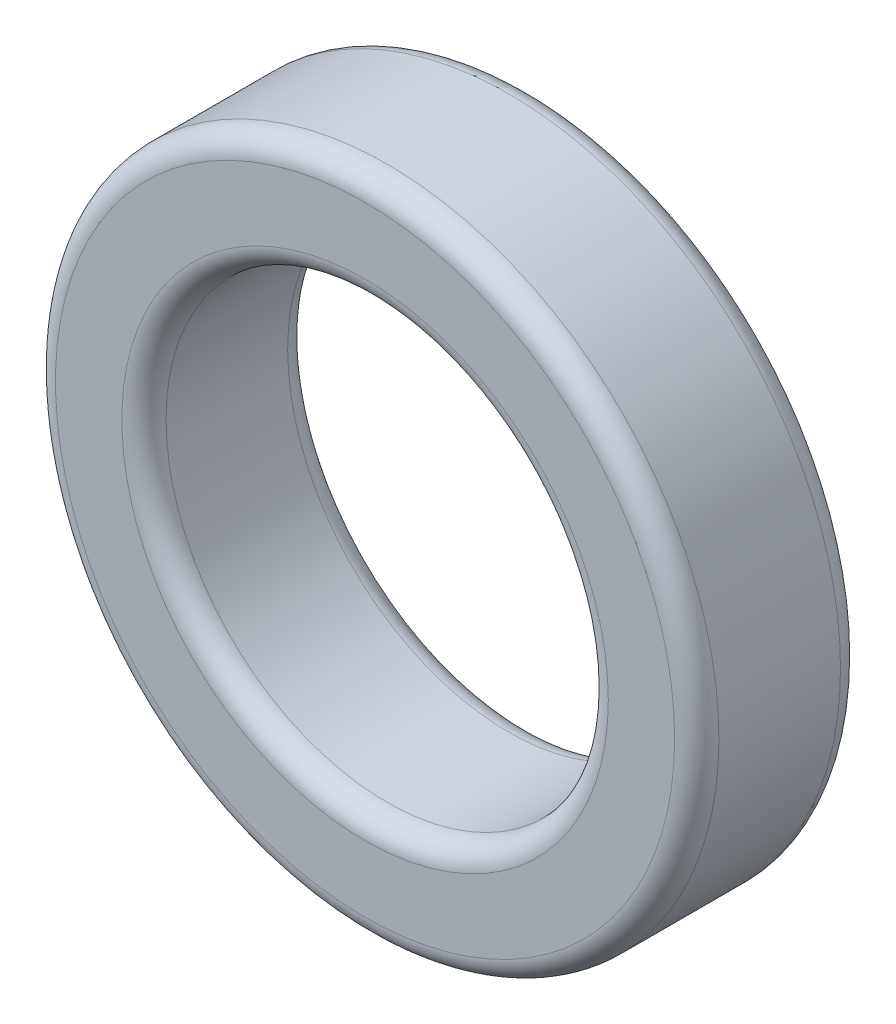
ISO-10303-21;
HEADER;
FILE_DESCRIPTION(('STEP AP214'),'2;1');
FILE_NAME('part.step','',(''),(''),'','','');
FILE_SCHEMA(('AUTOMOTIVE_DESIGN { 1 0 10303 214 1 1 1 1 }'));
ENDSEC;
DATA;
#1=APPLICATION_CONTEXT('core data for automotive mechanical design processes');
#2=APPLICATION_PROTOCOL_DEFINITION('international standard','automotive_design',2000,#1);
#3=PRODUCT_CONTEXT('',#1,'mechanical');
#4=PRODUCT('Part','Part','',(#3));
#5=PRODUCT_RELATED_PRODUCT_CATEGORY('part','',(#4));
#6=PRODUCT_DEFINITION_FORMATION('','',#4);
#7=PRODUCT_DEFINITION_CONTEXT('part definition',#1,'design');
#8=PRODUCT_DEFINITION('design','',#6,#7);
#9=PRODUCT_DEFINITION_SHAPE('','',#8);
#10=(LENGTH_UNIT() NAMED_UNIT(*) SI_UNIT(.MILLI.,.METRE.));
#11=(NAMED_UNIT(*) PLANE_ANGLE_UNIT() SI_UNIT($,.RADIAN.));
#12=(NAMED_UNIT(*) SI_UNIT($,.STERADIAN.) SOLID_ANGLE_UNIT());
#13=UNCERTAINTY_MEASURE_WITH_UNIT(LENGTH_MEASURE(1.E-05),#10,'distance_accuracy_value','');
#14=(GEOMETRIC_REPRESENTATION_CONTEXT(3) GLOBAL_UNCERTAINTY_ASSIGNED_CONTEXT((#13)) GLOBAL_UNIT_ASSIGNED_CONTEXT((#10,
#11,#12)) REPRESENTATION_CONTEXT('',''));
#15=CARTESIAN_POINT('',(0.,0.,0.));
#16=DIRECTION('',(0.,0.,1.));
#17=DIRECTION('',(1.,0.,0.));
#18=AXIS2_PLACEMENT_3D('',#15,#16,#17);
#19=CARTESIAN_POINT('',(0.,0.,3.302));
#20=DIRECTION('',(0.,0.,1.));
#21=DIRECTION('',(1.,0.,0.));
#22=AXIS2_PLACEMENT_3D('',#19,#20,#21);
#23=TOROIDAL_SURFACE('',#22,7.112,0.508);
#24=CARTESIAN_POINT('',(0.,0.,3.81));
#25=DIRECTION('',(0.,0.,1.));
#26=DIRECTION('',(1.,0.,0.));
#27=AXIS2_PLACEMENT_3D('',#24,#25,#26);
#28=CIRCLE('',#27,7.112);
#29=CARTESIAN_POINT('',(7.112,0.,3.81));
#30=VERTEX_POINT('',#29);
#31=EDGE_CURVE('E37',#30,#30,#28,.T.);
#32=ORIENTED_EDGE('',*,*,#31,.F.);
#33=EDGE_LOOP('',(#32));
#34=FACE_BOUND('',#33,.T.);
#35=CARTESIAN_POINT('',(0.,0.,3.302));
#36=DIRECTION('',(0.,0.,1.));
#37=DIRECTION('',(1.,0.,0.));
#38=AXIS2_PLACEMENT_3D('',#35,#36,#37);
#39=CIRCLE('',#38,7.62);
#40=CARTESIAN_POINT('',(-7.62,0.,3.302));
#41=VERTEX_POINT('',#40);
#42=EDGE_CURVE('E10',#41,#41,#39,.F.);
#43=ORIENTED_EDGE('',*,*,#42,.F.);
#44=EDGE_LOOP('',(#43));
#45=FACE_BOUND('',#44,.T.);
#46=ADVANCED_FACE('F31',(#34,#45),#23,.T.);
#47=CARTESIAN_POINT('',(0.,0.,0.508));
#48=DIRECTION('',(0.,0.,1.));
#49=DIRECTION('',(1.,0.,0.));
#50=AXIS2_PLACEMENT_3D('',#47,#48,#49);
#51=TOROIDAL_SURFACE('',#50,7.112,0.508);
#52=CARTESIAN_POINT('',(0.,0.,0.508));
#53=DIRECTION('',(0.,0.,1.));
#54=DIRECTION('',(1.,0.,0.));
#55=AXIS2_PLACEMENT_3D('',#52,#53,#54);
#56=CIRCLE('',#55,7.62);
#57=CARTESIAN_POINT('',(-7.62,0.,0.508));
#58=VERTEX_POINT('',#57);
#59=EDGE_CURVE('E45',#58,#58,#56,.T.);
#60=ORIENTED_EDGE('',*,*,#59,.F.);
#61=EDGE_LOOP('',(#60));
#62=FACE_BOUND('',#61,.T.);
#63=CARTESIAN_POINT('',(0.,0.,0.));
#64=DIRECTION('',(0.,0.,1.));
#65=DIRECTION('',(1.,0.,0.));
#66=AXIS2_PLACEMENT_3D('',#63,#64,#65);
#67=CIRCLE('',#66,7.112);
#68=CARTESIAN_POINT('',(7.112,0.,0.));
#69=VERTEX_POINT('',#68);
#70=EDGE_CURVE('E41',#69,#69,#67,.F.);
#71=ORIENTED_EDGE('',*,*,#70,.F.);
#72=EDGE_LOOP('',(#71));
#73=FACE_BOUND('',#72,.T.);
#74=ADVANCED_FACE('F84',(#62,#73),#51,.T.);
#75=CARTESIAN_POINT('',(0.,0.,0.508));
#76=DIRECTION('',(0.,0.,1.));
#77=DIRECTION('',(1.,0.,0.));
#78=AXIS2_PLACEMENT_3D('',#75,#76,#77);
#79=TOROIDAL_SURFACE('',#78,5.588,0.508);
#80=CARTESIAN_POINT('',(0.,0.,0.));
#81=DIRECTION('',(0.,0.,1.));
#82=DIRECTION('',(1.,0.,0.));
#83=AXIS2_PLACEMENT_3D('',#80,#81,#82);
#84=CIRCLE('',#83,5.588);
#85=CARTESIAN_POINT('',(5.588,0.,0.));
#86=VERTEX_POINT('',#85);
#87=EDGE_CURVE('E53',#86,#86,#84,.T.);
#88=ORIENTED_EDGE('',*,*,#87,.F.);
#89=EDGE_LOOP('',(#88));
#90=FACE_BOUND('',#89,.T.);
#91=CARTESIAN_POINT('',(0.,0.,0.508));
#92=DIRECTION('',(0.,0.,1.));
#93=DIRECTION('',(1.,0.,0.));
#94=AXIS2_PLACEMENT_3D('',#91,#92,#93);
#95=CIRCLE('',#94,5.08);
#96=CARTESIAN_POINT('',(-5.08,0.,0.508));
#97=VERTEX_POINT('',#96);
#98=EDGE_CURVE('E50',#97,#97,#95,.F.);
#99=ORIENTED_EDGE('',*,*,#98,.F.);
#100=EDGE_LOOP('',(#99));
#101=FACE_BOUND('',#100,.T.);
#102=ADVANCED_FACE('F68',(#90,#101),#79,.T.);
#103=CARTESIAN_POINT('',(0.,0.,3.302));
#104=DIRECTION('',(0.,0.,1.));
#105=DIRECTION('',(1.,0.,0.));
#106=AXIS2_PLACEMENT_3D('',#103,#104,#105);
#107=TOROIDAL_SURFACE('',#106,5.588,0.508);
#108=CARTESIAN_POINT('',(0.,0.,3.81));
#109=DIRECTION('',(0.,0.,1.));
#110=DIRECTION('',(1.,0.,0.));
#111=AXIS2_PLACEMENT_3D('',#108,#109,#110);
#112=CIRCLE('',#111,5.588);
#113=CARTESIAN_POINT('',(5.588,0.,3.81));
#114=VERTEX_POINT('',#113);
#115=EDGE_CURVE('E59',#114,#114,#112,.F.);
#116=ORIENTED_EDGE('',*,*,#115,.F.);
#117=EDGE_LOOP('',(#116));
#118=FACE_BOUND('',#117,.T.);
#119=CARTESIAN_POINT('',(0.,0.,3.302));
#120=DIRECTION('',(0.,0.,1.));
#121=DIRECTION('',(1.,0.,0.));
#122=AXIS2_PLACEMENT_3D('',#119,#120,#121);
#123=CIRCLE('',#122,5.08);
#124=CARTESIAN_POINT('',(-5.08,0.,3.302));
#125=VERTEX_POINT('',#124);
#126=EDGE_CURVE('E56',#125,#125,#123,.T.);
#127=ORIENTED_EDGE('',*,*,#126,.F.);
#128=EDGE_LOOP('',(#127));
#129=FACE_BOUND('',#128,.T.);
#130=ADVANCED_FACE('F65',(#118,#129),#107,.T.);
#131=CARTESIAN_POINT('',(0.,0.,3.81));
#132=DIRECTION('',(0.,0.,1.));
#133=DIRECTION('',(1.,0.,0.));
#134=AXIS2_PLACEMENT_3D('',#131,#132,#133);
#135=PLANE('',#134);
#136=ORIENTED_EDGE('',*,*,#31,.T.);
#137=EDGE_LOOP('',(#136));
#138=FACE_BOUND('',#137,.T.);
#139=ORIENTED_EDGE('',*,*,#115,.T.);
#140=EDGE_LOOP('',(#139));
#141=FACE_BOUND('',#140,.T.);
#142=ADVANCED_FACE('F63',(#138,#141),#135,.T.);
#143=CARTESIAN_POINT('',(0.,0.,0.));
#144=DIRECTION('',(0.,0.,1.));
#145=DIRECTION('',(1.,0.,0.));
#146=AXIS2_PLACEMENT_3D('',#143,#144,#145);
#147=PLANE('',#146);
#148=ORIENTED_EDGE('',*,*,#70,.T.);
#149=EDGE_LOOP('',(#148));
#150=FACE_BOUND('',#149,.T.);
#151=ORIENTED_EDGE('',*,*,#87,.T.);
#152=EDGE_LOOP('',(#151));
#153=FACE_BOUND('',#152,.T.);
#154=ADVANCED_FACE('F80',(#150,#153),#147,.F.);
#155=CARTESIAN_POINT('',(0.,0.,3.81));
#156=DIRECTION('',(0.,0.,-1.));
#157=DIRECTION('',(-1.,0.,0.));
#158=AXIS2_PLACEMENT_3D('',#155,#156,#157);
#159=CYLINDRICAL_SURFACE('',#158,7.62);
#160=CARTESIAN_POINT('',(-7.62,0.,3.302));
#161=CARTESIAN_POINT('',(-7.62,0.,3.27289583333333));
#162=CARTESIAN_POINT('',(-7.62,0.,3.24379166666667));
#163=CARTESIAN_POINT('',(-7.62,0.,3.18558333333333));
#164=CARTESIAN_POINT('',(-7.62,0.,3.15647916666667));
#165=CARTESIAN_POINT('',(-7.62,0.,3.09827083333333));
#166=CARTESIAN_POINT('',(-7.62,0.,3.06916666666667));
#167=CARTESIAN_POINT('',(-7.62,0.,3.01095833333333));
#168=CARTESIAN_POINT('',(-7.62,0.,2.98185416666667));
#169=CARTESIAN_POINT('',(-7.62,0.,2.92364583333333));
#170=CARTESIAN_POINT('',(-7.62,0.,2.89454166666667));
#171=CARTESIAN_POINT('',(-7.62,0.,2.83633333333333));
#172=CARTESIAN_POINT('',(-7.62,0.,2.80722916666667));
#173=CARTESIAN_POINT('',(-7.62,0.,2.74902083333333));
#174=CARTESIAN_POINT('',(-7.62,0.,2.71991666666667));
#175=CARTESIAN_POINT('',(-7.62,0.,2.66170833333333));
#176=CARTESIAN_POINT('',(-7.62,0.,2.63260416666667));
#177=CARTESIAN_POINT('',(-7.62,0.,2.57439583333333));
#178=CARTESIAN_POINT('',(-7.62,0.,2.54529166666667));
#179=CARTESIAN_POINT('',(-7.62,0.,2.48708333333333));
#180=CARTESIAN_POINT('',(-7.62,0.,2.45797916666667));
#181=CARTESIAN_POINT('',(-7.62,0.,2.39977083333333));
#182=CARTESIAN_POINT('',(-7.62,0.,2.37066666666667));
#183=CARTESIAN_POINT('',(-7.62,0.,2.31245833333333));
#184=CARTESIAN_POINT('',(-7.62,0.,2.28335416666667));
#185=CARTESIAN_POINT('',(-7.62,0.,2.22514583333333));
#186=CARTESIAN_POINT('',(-7.62,0.,2.19604166666667));
#187=CARTESIAN_POINT('',(-7.62,0.,2.13783333333333));
#188=CARTESIAN_POINT('',(-7.62,0.,2.10872916666667));
#189=CARTESIAN_POINT('',(-7.62,0.,2.05052083333333));
#190=CARTESIAN_POINT('',(-7.62,0.,2.02141666666667));
#191=CARTESIAN_POINT('',(-7.62,0.,1.96320833333333));
#192=CARTESIAN_POINT('',(-7.62,0.,1.93410416666667));
#193=CARTESIAN_POINT('',(-7.62,0.,1.87589583333333));
#194=CARTESIAN_POINT('',(-7.62,0.,1.84679166666667));
#195=CARTESIAN_POINT('',(-7.62,0.,1.78858333333333));
#196=CARTESIAN_POINT('',(-7.62,0.,1.75947916666667));
#197=CARTESIAN_POINT('',(-7.62,0.,1.70127083333333));
#198=CARTESIAN_POINT('',(-7.62,0.,1.67216666666667));
#199=CARTESIAN_POINT('',(-7.62,0.,1.61395833333333));
#200=CARTESIAN_POINT('',(-7.62,0.,1.58485416666667));
#201=CARTESIAN_POINT('',(-7.62,0.,1.52664583333333));
#202=CARTESIAN_POINT('',(-7.62,0.,1.49754166666667));
#203=CARTESIAN_POINT('',(-7.62,0.,1.43933333333333));
#204=CARTESIAN_POINT('',(-7.62,0.,1.41022916666667));
#205=CARTESIAN_POINT('',(-7.62,0.,1.35202083333333));
#206=CARTESIAN_POINT('',(-7.62,0.,1.32291666666667));
#207=CARTESIAN_POINT('',(-7.62,0.,1.26470833333333));
#208=CARTESIAN_POINT('',(-7.62,0.,1.23560416666667));
#209=CARTESIAN_POINT('',(-7.62,0.,1.17739583333333));
#210=CARTESIAN_POINT('',(-7.62,0.,1.14829166666667));
#211=CARTESIAN_POINT('',(-7.62,0.,1.09008333333333));
#212=CARTESIAN_POINT('',(-7.62,0.,1.06097916666667));
#213=CARTESIAN_POINT('',(-7.62,0.,1.00277083333333));
#214=CARTESIAN_POINT('',(-7.62,0.,0.973666666666666));
#215=CARTESIAN_POINT('',(-7.62,0.,0.915458333333333));
#216=CARTESIAN_POINT('',(-7.62,0.,0.886354166666666));
#217=CARTESIAN_POINT('',(-7.62,0.,0.828145833333333));
#218=CARTESIAN_POINT('',(-7.62,0.,0.799041666666666));
#219=CARTESIAN_POINT('',(-7.62,0.,0.740833333333333));
#220=CARTESIAN_POINT('',(-7.62,0.,0.711729166666666));
#221=CARTESIAN_POINT('',(-7.62,0.,0.653520833333333));
#222=CARTESIAN_POINT('',(-7.62,0.,0.624416666666667));
#223=CARTESIAN_POINT('',(-7.62,0.,0.566208333333333));
#224=CARTESIAN_POINT('',(-7.62,0.,0.537104166666666));
#225=CARTESIAN_POINT('',(-7.62,0.,0.508));
#226=B_SPLINE_CURVE_WITH_KNOTS('',3,(#160,#161,#162,#163,#164,#165,#166,#167,#168,#169,#170,
#171,#172,#173,#174,#175,#176,#177,#178,#179,#180,#181,#182,#183,#184,#185,#186,#187,#188,#189,
#190,#191,#192,#193,#194,#195,#196,#197,#198,#199,#200,#201,#202,#203,#204,#205,#206,#207,#208,
#209,#210,#211,#212,#213,#214,#215,#216,#217,#218,#219,#220,#221,#222,#223,#224,#225),
.UNSPECIFIED.,.F.,.F.,(4,2,2,2,2,2,2,2,2,2,2,2,2,2,2,2,2,2,2,2,2,2,2,2,2,2,2,2,2,2,2,2,4),(0.,
0.0873124999999997,0.174625,0.2619375,0.34925,0.4365625,0.523875,0.6111875,0.6985,0.7858125,
0.873124999999999,0.9604375,1.04775,1.1350625,1.222375,1.3096875,1.397,1.4843125,1.571625,
1.6589375,1.74625,1.8335625,1.920875,2.0081875,2.0955,2.1828125,2.270125,2.3574375,2.44475,
2.5320625,2.619375,2.7066875,2.794),.UNSPECIFIED.);
#227=EDGE_CURVE('BSEAM74',#41,#58,#226,.T.);
#228=ORIENTED_EDGE('',*,*,#42,.T.);
#229=ORIENTED_EDGE('',*,*,#59,.T.);
#230=ORIENTED_EDGE('',*,*,#227,.T.);
#231=ORIENTED_EDGE('',*,*,#227,.F.);
#232=EDGE_LOOP('',(#228,#230,#229,#231));
#233=FACE_BOUND('',#232,.T.);
#234=ADVANCED_FACE('F74',(#233),#159,.T.);
#235=CARTESIAN_POINT('',(0.,0.,3.81));
#236=DIRECTION('',(0.,0.,-1.));
#237=DIRECTION('',(-1.,0.,0.));
#238=AXIS2_PLACEMENT_3D('',#235,#236,#237);
#239=CYLINDRICAL_SURFACE('',#238,5.08);
#240=CARTESIAN_POINT('',(-5.08,0.,0.508));
#241=CARTESIAN_POINT('',(-5.08,0.,0.537104166666666));
#242=CARTESIAN_POINT('',(-5.08,0.,0.566208333333333));
#243=CARTESIAN_POINT('',(-5.08,0.,0.624416666666667));
#244=CARTESIAN_POINT('',(-5.08,0.,0.653520833333333));
#245=CARTESIAN_POINT('',(-5.08,0.,0.711729166666666));
#246=CARTESIAN_POINT('',(-5.08,0.,0.740833333333333));
#247=CARTESIAN_POINT('',(-5.08,0.,0.799041666666666));
#248=CARTESIAN_POINT('',(-5.08,0.,0.828145833333333));
#249=CARTESIAN_POINT('',(-5.08,0.,0.886354166666666));
#250=CARTESIAN_POINT('',(-5.08,0.,0.915458333333333));
#251=CARTESIAN_POINT('',(-5.08,0.,0.973666666666666));
#252=CARTESIAN_POINT('',(-5.08,0.,1.00277083333333));
#253=CARTESIAN_POINT('',(-5.08,0.,1.06097916666667));
#254=CARTESIAN_POINT('',(-5.08,0.,1.09008333333333));
#255=CARTESIAN_POINT('',(-5.08,0.,1.14829166666667));
#256=CARTESIAN_POINT('',(-5.08,0.,1.17739583333333));
#257=CARTESIAN_POINT('',(-5.08,0.,1.23560416666667));
#258=CARTESIAN_POINT('',(-5.08,0.,1.26470833333333));
#259=CARTESIAN_POINT('',(-5.08,0.,1.32291666666667));
#260=CARTESIAN_POINT('',(-5.08,0.,1.35202083333333));
#261=CARTESIAN_POINT('',(-5.08,0.,1.41022916666667));
#262=CARTESIAN_POINT('',(-5.08,0.,1.43933333333333));
#263=CARTESIAN_POINT('',(-5.08,0.,1.49754166666667));
#264=CARTESIAN_POINT('',(-5.08,0.,1.52664583333333));
#265=CARTESIAN_POINT('',(-5.08,0.,1.58485416666667));
#266=CARTESIAN_POINT('',(-5.08,0.,1.61395833333333));
#267=CARTESIAN_POINT('',(-5.08,0.,1.67216666666667));
#268=CARTESIAN_POINT('',(-5.08,0.,1.70127083333333));
#269=CARTESIAN_POINT('',(-5.08,0.,1.75947916666667));
#270=CARTESIAN_POINT('',(-5.08,0.,1.78858333333333));
#271=CARTESIAN_POINT('',(-5.08,0.,1.84679166666667));
#272=CARTESIAN_POINT('',(-5.08,0.,1.87589583333333));
#273=CARTESIAN_POINT('',(-5.08,0.,1.93410416666667));
#274=CARTESIAN_POINT('',(-5.08,0.,1.96320833333333));
#275=CARTESIAN_POINT('',(-5.08,0.,2.02141666666667));
#276=CARTESIAN_POINT('',(-5.08,0.,2.05052083333333));
#277=CARTESIAN_POINT('',(-5.08,0.,2.10872916666667));
#278=CARTESIAN_POINT('',(-5.08,0.,2.13783333333333));
#279=CARTESIAN_POINT('',(-5.08,0.,2.19604166666667));
#280=CARTESIAN_POINT('',(-5.08,0.,2.22514583333333));
#281=CARTESIAN_POINT('',(-5.08,0.,2.28335416666667));
#282=CARTESIAN_POINT('',(-5.08,0.,2.31245833333333));
#283=CARTESIAN_POINT('',(-5.08,0.,2.37066666666667));
#284=CARTESIAN_POINT('',(-5.08,0.,2.39977083333333));
#285=CARTESIAN_POINT('',(-5.08,0.,2.45797916666667));
#286=CARTESIAN_POINT('',(-5.08,0.,2.48708333333333));
#287=CARTESIAN_POINT('',(-5.08,0.,2.54529166666667));
#288=CARTESIAN_POINT('',(-5.08,0.,2.57439583333333));
#289=CARTESIAN_POINT('',(-5.08,0.,2.63260416666667));
#290=CARTESIAN_POINT('',(-5.08,0.,2.66170833333333));
#291=CARTESIAN_POINT('',(-5.08,0.,2.71991666666667));
#292=CARTESIAN_POINT('',(-5.08,0.,2.74902083333333));
#293=CARTESIAN_POINT('',(-5.08,0.,2.80722916666667));
#294=CARTESIAN_POINT('',(-5.08,0.,2.83633333333333));
#295=CARTESIAN_POINT('',(-5.08,0.,2.89454166666667));
#296=CARTESIAN_POINT('',(-5.08,0.,2.92364583333333));
#297=CARTESIAN_POINT('',(-5.08,0.,2.98185416666667));
#298=CARTESIAN_POINT('',(-5.08,0.,3.01095833333333));
#299=CARTESIAN_POINT('',(-5.08,0.,3.06916666666667));
#300=CARTESIAN_POINT('',(-5.08,0.,3.09827083333333));
#301=CARTESIAN_POINT('',(-5.08,0.,3.15647916666667));
#302=CARTESIAN_POINT('',(-5.08,0.,3.18558333333333));
#303=CARTESIAN_POINT('',(-5.08,0.,3.24379166666667));
#304=CARTESIAN_POINT('',(-5.08,0.,3.27289583333333));
#305=CARTESIAN_POINT('',(-5.08,0.,3.302));
#306=B_SPLINE_CURVE_WITH_KNOTS('',3,(#240,#241,#242,#243,#244,#245,#246,#247,#248,#249,#250,
#251,#252,#253,#254,#255,#256,#257,#258,#259,#260,#261,#262,#263,#264,#265,#266,#267,#268,#269,
#270,#271,#272,#273,#274,#275,#276,#277,#278,#279,#280,#281,#282,#283,#284,#285,#286,#287,#288,
#289,#290,#291,#292,#293,#294,#295,#296,#297,#298,#299,#300,#301,#302,#303,#304,#305),
.UNSPECIFIED.,.F.,.F.,(4,2,2,2,2,2,2,2,2,2,2,2,2,2,2,2,2,2,2,2,2,2,2,2,2,2,2,2,2,2,2,2,4),(0.,
0.0873125000000002,0.174625,0.2619375,0.34925,0.4365625,0.523875,0.6111875,0.6985,0.7858125,
0.873125,0.9604375,1.04775,1.1350625,1.222375,1.3096875,1.397,1.4843125,1.571625,1.6589375,
1.74625,1.8335625,1.920875,2.0081875,2.0955,2.1828125,2.270125,2.3574375,2.44475,2.5320625,
2.619375,2.7066875,2.794),.UNSPECIFIED.);
#307=EDGE_CURVE('BSEAM72',#97,#125,#306,.T.);
#308=ORIENTED_EDGE('',*,*,#98,.T.);
#309=ORIENTED_EDGE('',*,*,#126,.T.);
#310=ORIENTED_EDGE('',*,*,#307,.T.);
#311=ORIENTED_EDGE('',*,*,#307,.F.);
#312=EDGE_LOOP('',(#308,#310,#309,#311));
#313=FACE_BOUND('',#312,.T.);
#314=ADVANCED_FACE('F72',(#313),#239,.F.);
#315=CLOSED_SHELL('',(#46,#74,#102,#130,#142,#154,#234,#314));
#316=MANIFOLD_SOLID_BREP('B2',#315);
#317=ADVANCED_BREP_SHAPE_REPRESENTATION('',(#18,#316),#14);
#318=SHAPE_DEFINITION_REPRESENTATION(#9,#317);
ENDSEC;
END-ISO-10303-21;
